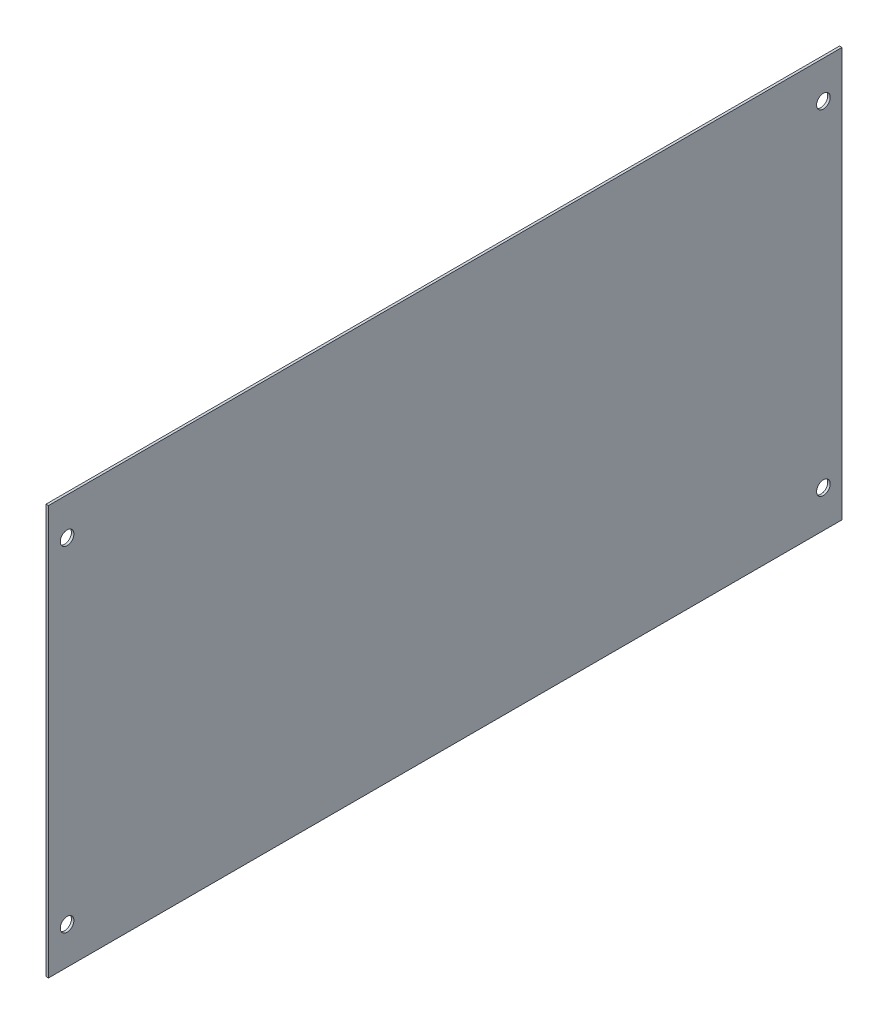
ISO-10303-21;
HEADER;
FILE_DESCRIPTION(('STEP AP214'),'2;1');
FILE_NAME('part.step','',(''),(''),'','','');
FILE_SCHEMA(('AUTOMOTIVE_DESIGN { 1 0 10303 214 1 1 1 1 }'));
ENDSEC;
DATA;
#1=APPLICATION_CONTEXT('core data for automotive mechanical design processes');
#2=APPLICATION_PROTOCOL_DEFINITION('international standard','automotive_design',2000,#1);
#3=PRODUCT_CONTEXT('',#1,'mechanical');
#4=PRODUCT('Part','Part','',(#3));
#5=PRODUCT_RELATED_PRODUCT_CATEGORY('part','',(#4));
#6=PRODUCT_DEFINITION_FORMATION('','',#4);
#7=PRODUCT_DEFINITION_CONTEXT('part definition',#1,'design');
#8=PRODUCT_DEFINITION('design','',#6,#7);
#9=PRODUCT_DEFINITION_SHAPE('','',#8);
#10=(LENGTH_UNIT() NAMED_UNIT(*) SI_UNIT(.MILLI.,.METRE.));
#11=(NAMED_UNIT(*) PLANE_ANGLE_UNIT() SI_UNIT($,.RADIAN.));
#12=(NAMED_UNIT(*) SI_UNIT($,.STERADIAN.) SOLID_ANGLE_UNIT());
#13=UNCERTAINTY_MEASURE_WITH_UNIT(LENGTH_MEASURE(1.E-05),#10,'distance_accuracy_value','');
#14=(GEOMETRIC_REPRESENTATION_CONTEXT(3) GLOBAL_UNCERTAINTY_ASSIGNED_CONTEXT((#13)) GLOBAL_UNIT_ASSIGNED_CONTEXT((#10,
#11,#12)) REPRESENTATION_CONTEXT('',''));
#15=CARTESIAN_POINT('',(0.,0.,0.));
#16=DIRECTION('',(0.,0.,1.));
#17=DIRECTION('',(1.,0.,0.));
#18=AXIS2_PLACEMENT_3D('',#15,#16,#17);
#19=CARTESIAN_POINT('',(0.,-165.,-320.));
#20=DIRECTION('',(0.,0.,-1.));
#21=DIRECTION('',(0.,1.,0.));
#22=AXIS2_PLACEMENT_3D('',#19,#20,#21);
#23=PLANE('',#22);
#24=DIRECTION('',(1.,0.,0.));
#25=VECTOR('',#24,1.);
#26=CARTESIAN_POINT('',(0.,-165.,-320.));
#27=LINE('',#26,#25);
#28=CARTESIAN_POINT('',(0.,-165.,-320.));
#29=VERTEX_POINT('',#28);
#30=CARTESIAN_POINT('',(2.,-165.,-320.));
#31=VERTEX_POINT('',#30);
#32=EDGE_CURVE('E11',#29,#31,#27,.T.);
#33=ORIENTED_EDGE('',*,*,#32,.F.);
#34=DIRECTION('',(0.,1.,0.));
#35=VECTOR('',#34,1.);
#36=CARTESIAN_POINT('',(0.,-165.,-320.));
#37=LINE('',#36,#35);
#38=CARTESIAN_POINT('',(0.,165.,-320.));
#39=VERTEX_POINT('',#38);
#40=EDGE_CURVE('E108',#29,#39,#37,.T.);
#41=ORIENTED_EDGE('',*,*,#40,.T.);
#42=DIRECTION('',(1.,0.,0.));
#43=VECTOR('',#42,1.);
#44=CARTESIAN_POINT('',(0.,165.,-320.));
#45=LINE('',#44,#43);
#46=CARTESIAN_POINT('',(2.,165.,-320.));
#47=VERTEX_POINT('',#46);
#48=EDGE_CURVE('E58',#39,#47,#45,.T.);
#49=ORIENTED_EDGE('',*,*,#48,.T.);
#50=DIRECTION('',(0.,1.,0.));
#51=VECTOR('',#50,1.);
#52=CARTESIAN_POINT('',(2.,0.,-320.));
#53=LINE('',#52,#51);
#54=EDGE_CURVE('E122',#31,#47,#53,.T.);
#55=ORIENTED_EDGE('',*,*,#54,.F.);
#56=EDGE_LOOP('',(#33,#41,#49,#55));
#57=FACE_BOUND('',#56,.T.);
#58=ADVANCED_FACE('F47',(#57),#23,.T.);
#59=CARTESIAN_POINT('',(0.,165.,-320.));
#60=DIRECTION('',(0.,1.,0.));
#61=DIRECTION('',(0.,0.,1.));
#62=AXIS2_PLACEMENT_3D('',#59,#60,#61);
#63=PLANE('',#62);
#64=ORIENTED_EDGE('',*,*,#48,.F.);
#65=DIRECTION('',(0.,0.,1.));
#66=VECTOR('',#65,1.);
#67=CARTESIAN_POINT('',(0.,165.,-320.));
#68=LINE('',#67,#66);
#69=CARTESIAN_POINT('',(0.,165.,320.));
#70=VERTEX_POINT('',#69);
#71=EDGE_CURVE('E99',#39,#70,#68,.T.);
#72=ORIENTED_EDGE('',*,*,#71,.T.);
#73=DIRECTION('',(1.,0.,0.));
#74=VECTOR('',#73,1.);
#75=CARTESIAN_POINT('',(0.,165.,320.));
#76=LINE('',#75,#74);
#77=CARTESIAN_POINT('',(2.,165.,320.));
#78=VERTEX_POINT('',#77);
#79=EDGE_CURVE('E66',#70,#78,#76,.T.);
#80=ORIENTED_EDGE('',*,*,#79,.T.);
#81=DIRECTION('',(0.,0.,-1.));
#82=VECTOR('',#81,1.);
#83=CARTESIAN_POINT('',(2.,165.,0.));
#84=LINE('',#83,#82);
#85=EDGE_CURVE('E126',#47,#78,#84,.F.);
#86=ORIENTED_EDGE('',*,*,#85,.F.);
#87=EDGE_LOOP('',(#64,#72,#80,#86));
#88=FACE_BOUND('',#87,.T.);
#89=ADVANCED_FACE('F105',(#88),#63,.T.);
#90=CARTESIAN_POINT('',(0.,-165.,320.));
#91=DIRECTION('',(0.,0.,1.));
#92=DIRECTION('',(0.,-1.,0.));
#93=AXIS2_PLACEMENT_3D('',#90,#91,#92);
#94=PLANE('',#93);
#95=ORIENTED_EDGE('',*,*,#79,.F.);
#96=DIRECTION('',(0.,-1.,0.));
#97=VECTOR('',#96,1.);
#98=CARTESIAN_POINT('',(0.,-165.,320.));
#99=LINE('',#98,#97);
#100=CARTESIAN_POINT('',(0.,-165.,320.));
#101=VERTEX_POINT('',#100);
#102=EDGE_CURVE('E88',#70,#101,#99,.T.);
#103=ORIENTED_EDGE('',*,*,#102,.T.);
#104=DIRECTION('',(1.,0.,0.));
#105=VECTOR('',#104,1.);
#106=CARTESIAN_POINT('',(0.,-165.,320.));
#107=LINE('',#106,#105);
#108=CARTESIAN_POINT('',(2.,-165.,320.));
#109=VERTEX_POINT('',#108);
#110=EDGE_CURVE('E51',#101,#109,#107,.T.);
#111=ORIENTED_EDGE('',*,*,#110,.T.);
#112=DIRECTION('',(0.,1.,0.));
#113=VECTOR('',#112,1.);
#114=CARTESIAN_POINT('',(2.,0.,320.));
#115=LINE('',#114,#113);
#116=EDGE_CURVE('E90',#78,#109,#115,.F.);
#117=ORIENTED_EDGE('',*,*,#116,.F.);
#118=EDGE_LOOP('',(#95,#103,#111,#117));
#119=FACE_BOUND('',#118,.T.);
#120=ADVANCED_FACE('F87',(#119),#94,.T.);
#121=CARTESIAN_POINT('',(0.,135.,305.));
#122=DIRECTION('',(1.,0.,0.));
#123=DIRECTION('',(0.,0.,-1.));
#124=AXIS2_PLACEMENT_3D('',#121,#122,#123);
#125=CYLINDRICAL_SURFACE('',#124,5.50000000000002);
#126=CARTESIAN_POINT('',(2.,135.,305.));
#127=DIRECTION('',(1.,0.,0.));
#128=DIRECTION('',(0.,0.,-1.));
#129=AXIS2_PLACEMENT_3D('',#126,#127,#128);
#130=CIRCLE('',#129,5.50000000000002);
#131=CARTESIAN_POINT('',(2.,135.,299.5));
#132=VERTEX_POINT('',#131);
#133=EDGE_CURVE('E107',#132,#132,#130,.T.);
#134=ORIENTED_EDGE('',*,*,#133,.T.);
#135=EDGE_LOOP('',(#134));
#136=FACE_BOUND('',#135,.T.);
#137=CARTESIAN_POINT('',(0.,135.,305.));
#138=DIRECTION('',(1.,0.,0.));
#139=DIRECTION('',(0.,0.,-1.));
#140=AXIS2_PLACEMENT_3D('',#137,#138,#139);
#141=CIRCLE('',#140,5.50000000000002);
#142=CARTESIAN_POINT('',(0.,135.,299.5));
#143=VERTEX_POINT('',#142);
#144=EDGE_CURVE('E139',#143,#143,#141,.T.);
#145=ORIENTED_EDGE('',*,*,#144,.F.);
#146=EDGE_LOOP('',(#145));
#147=FACE_BOUND('',#146,.T.);
#148=ADVANCED_FACE('F205',(#136,#147),#125,.F.);
#149=CARTESIAN_POINT('',(0.,135.,-305.));
#150=DIRECTION('',(1.,0.,0.));
#151=DIRECTION('',(0.,0.,-1.));
#152=AXIS2_PLACEMENT_3D('',#149,#150,#151);
#153=CYLINDRICAL_SURFACE('',#152,5.50000000000002);
#154=CARTESIAN_POINT('',(2.,135.,-305.));
#155=DIRECTION('',(1.,0.,0.));
#156=DIRECTION('',(0.,0.,-1.));
#157=AXIS2_PLACEMENT_3D('',#154,#155,#156);
#158=CIRCLE('',#157,5.50000000000002);
#159=CARTESIAN_POINT('',(2.,135.,-310.5));
#160=VERTEX_POINT('',#159);
#161=EDGE_CURVE('E113',#160,#160,#158,.T.);
#162=ORIENTED_EDGE('',*,*,#161,.T.);
#163=EDGE_LOOP('',(#162));
#164=FACE_BOUND('',#163,.T.);
#165=CARTESIAN_POINT('',(0.,135.,-305.));
#166=DIRECTION('',(1.,0.,0.));
#167=DIRECTION('',(0.,0.,-1.));
#168=AXIS2_PLACEMENT_3D('',#165,#166,#167);
#169=CIRCLE('',#168,5.50000000000002);
#170=CARTESIAN_POINT('',(0.,135.,-310.5));
#171=VERTEX_POINT('',#170);
#172=EDGE_CURVE('E143',#171,#171,#169,.T.);
#173=ORIENTED_EDGE('',*,*,#172,.F.);
#174=EDGE_LOOP('',(#173));
#175=FACE_BOUND('',#174,.T.);
#176=ADVANCED_FACE('F170',(#164,#175),#153,.F.);
#177=CARTESIAN_POINT('',(0.,-135.,-305.000000000003));
#178=DIRECTION('',(1.,0.,0.));
#179=DIRECTION('',(0.,0.,-1.));
#180=AXIS2_PLACEMENT_3D('',#177,#178,#179);
#181=CYLINDRICAL_SURFACE('',#180,5.50000000000002);
#182=CARTESIAN_POINT('',(2.,-135.,-305.000000000003));
#183=DIRECTION('',(1.,0.,0.));
#184=DIRECTION('',(0.,0.,-1.));
#185=AXIS2_PLACEMENT_3D('',#182,#183,#184);
#186=CIRCLE('',#185,5.50000000000002);
#187=CARTESIAN_POINT('',(2.,-135.,-310.500000000003));
#188=VERTEX_POINT('',#187);
#189=EDGE_CURVE('E159',#188,#188,#186,.T.);
#190=ORIENTED_EDGE('',*,*,#189,.T.);
#191=EDGE_LOOP('',(#190));
#192=FACE_BOUND('',#191,.T.);
#193=CARTESIAN_POINT('',(0.,-135.,-305.000000000003));
#194=DIRECTION('',(1.,0.,0.));
#195=DIRECTION('',(0.,0.,-1.));
#196=AXIS2_PLACEMENT_3D('',#193,#194,#195);
#197=CIRCLE('',#196,5.50000000000002);
#198=CARTESIAN_POINT('',(0.,-135.,-310.500000000003));
#199=VERTEX_POINT('',#198);
#200=EDGE_CURVE('E147',#199,#199,#197,.T.);
#201=ORIENTED_EDGE('',*,*,#200,.F.);
#202=EDGE_LOOP('',(#201));
#203=FACE_BOUND('',#202,.T.);
#204=ADVANCED_FACE('F180',(#192,#203),#181,.F.);
#205=CARTESIAN_POINT('',(0.,-135.,304.999999999997));
#206=DIRECTION('',(1.,0.,0.));
#207=DIRECTION('',(0.,0.,-1.));
#208=AXIS2_PLACEMENT_3D('',#205,#206,#207);
#209=CYLINDRICAL_SURFACE('',#208,5.50000000000002);
#210=CARTESIAN_POINT('',(2.,-135.,304.999999999997));
#211=DIRECTION('',(1.,0.,0.));
#212=DIRECTION('',(0.,0.,-1.));
#213=AXIS2_PLACEMENT_3D('',#210,#211,#212);
#214=CIRCLE('',#213,5.50000000000002);
#215=CARTESIAN_POINT('',(2.,-135.,299.499999999997));
#216=VERTEX_POINT('',#215);
#217=EDGE_CURVE('E156',#216,#216,#214,.T.);
#218=ORIENTED_EDGE('',*,*,#217,.T.);
#219=EDGE_LOOP('',(#218));
#220=FACE_BOUND('',#219,.T.);
#221=CARTESIAN_POINT('',(0.,-135.,304.999999999997));
#222=DIRECTION('',(1.,0.,0.));
#223=DIRECTION('',(0.,0.,-1.));
#224=AXIS2_PLACEMENT_3D('',#221,#222,#223);
#225=CIRCLE('',#224,5.50000000000002);
#226=CARTESIAN_POINT('',(0.,-135.,299.499999999997));
#227=VERTEX_POINT('',#226);
#228=EDGE_CURVE('E103',#227,#227,#225,.T.);
#229=ORIENTED_EDGE('',*,*,#228,.F.);
#230=EDGE_LOOP('',(#229));
#231=FACE_BOUND('',#230,.T.);
#232=ADVANCED_FACE('F183',(#220,#231),#209,.F.);
#233=CARTESIAN_POINT('',(0.,-165.,-320.));
#234=DIRECTION('',(0.,-1.,0.));
#235=DIRECTION('',(0.,0.,-1.));
#236=AXIS2_PLACEMENT_3D('',#233,#234,#235);
#237=PLANE('',#236);
#238=DIRECTION('',(0.,0.,-1.));
#239=VECTOR('',#238,1.);
#240=CARTESIAN_POINT('',(0.,-165.,-320.));
#241=LINE('',#240,#239);
#242=EDGE_CURVE('E101',#101,#29,#241,.T.);
#243=ORIENTED_EDGE('',*,*,#242,.T.);
#244=ORIENTED_EDGE('',*,*,#32,.T.);
#245=DIRECTION('',(0.,0.,-1.));
#246=VECTOR('',#245,1.);
#247=CARTESIAN_POINT('',(2.,-165.,0.));
#248=LINE('',#247,#246);
#249=EDGE_CURVE('E128',#109,#31,#248,.T.);
#250=ORIENTED_EDGE('',*,*,#249,.F.);
#251=ORIENTED_EDGE('',*,*,#110,.F.);
#252=EDGE_LOOP('',(#243,#244,#250,#251));
#253=FACE_BOUND('',#252,.T.);
#254=ADVANCED_FACE('F49',(#253),#237,.T.);
#255=CARTESIAN_POINT('',(2.,0.,0.));
#256=DIRECTION('',(1.,0.,0.));
#257=DIRECTION('',(0.,0.,-1.));
#258=AXIS2_PLACEMENT_3D('',#255,#256,#257);
#259=PLANE('',#258);
#260=ORIENTED_EDGE('',*,*,#133,.F.);
#261=EDGE_LOOP('',(#260));
#262=FACE_BOUND('',#261,.T.);
#263=ORIENTED_EDGE('',*,*,#161,.F.);
#264=EDGE_LOOP('',(#263));
#265=FACE_BOUND('',#264,.T.);
#266=ORIENTED_EDGE('',*,*,#189,.F.);
#267=EDGE_LOOP('',(#266));
#268=FACE_BOUND('',#267,.T.);
#269=ORIENTED_EDGE('',*,*,#217,.F.);
#270=EDGE_LOOP('',(#269));
#271=FACE_BOUND('',#270,.T.);
#272=ORIENTED_EDGE('',*,*,#116,.T.);
#273=ORIENTED_EDGE('',*,*,#249,.T.);
#274=ORIENTED_EDGE('',*,*,#54,.T.);
#275=ORIENTED_EDGE('',*,*,#85,.T.);
#276=EDGE_LOOP('',(#272,#273,#274,#275));
#277=FACE_BOUND('',#276,.T.);
#278=ADVANCED_FACE('F125',(#262,#265,#268,#271,#277),#259,.T.);
#279=CARTESIAN_POINT('',(0.,0.,0.));
#280=DIRECTION('',(1.,0.,0.));
#281=DIRECTION('',(0.,0.,-1.));
#282=AXIS2_PLACEMENT_3D('',#279,#280,#281);
#283=PLANE('',#282);
#284=ORIENTED_EDGE('',*,*,#144,.T.);
#285=EDGE_LOOP('',(#284));
#286=FACE_BOUND('',#285,.T.);
#287=ORIENTED_EDGE('',*,*,#172,.T.);
#288=EDGE_LOOP('',(#287));
#289=FACE_BOUND('',#288,.T.);
#290=ORIENTED_EDGE('',*,*,#200,.T.);
#291=EDGE_LOOP('',(#290));
#292=FACE_BOUND('',#291,.T.);
#293=ORIENTED_EDGE('',*,*,#228,.T.);
#294=EDGE_LOOP('',(#293));
#295=FACE_BOUND('',#294,.T.);
#296=ORIENTED_EDGE('',*,*,#102,.F.);
#297=ORIENTED_EDGE('',*,*,#71,.F.);
#298=ORIENTED_EDGE('',*,*,#40,.F.);
#299=ORIENTED_EDGE('',*,*,#242,.F.);
#300=EDGE_LOOP('',(#296,#297,#298,#299));
#301=FACE_BOUND('',#300,.T.);
#302=ADVANCED_FACE('F97',(#286,#289,#292,#295,#301),#283,.F.);
#303=CLOSED_SHELL('',(#58,#89,#120,#148,#176,#204,#232,#254,#278,#302));
#304=MANIFOLD_SOLID_BREP('B2',#303);
#305=ADVANCED_BREP_SHAPE_REPRESENTATION('',(#18,#304),#14);
#306=SHAPE_DEFINITION_REPRESENTATION(#9,#305);
ENDSEC;
END-ISO-10303-21;
